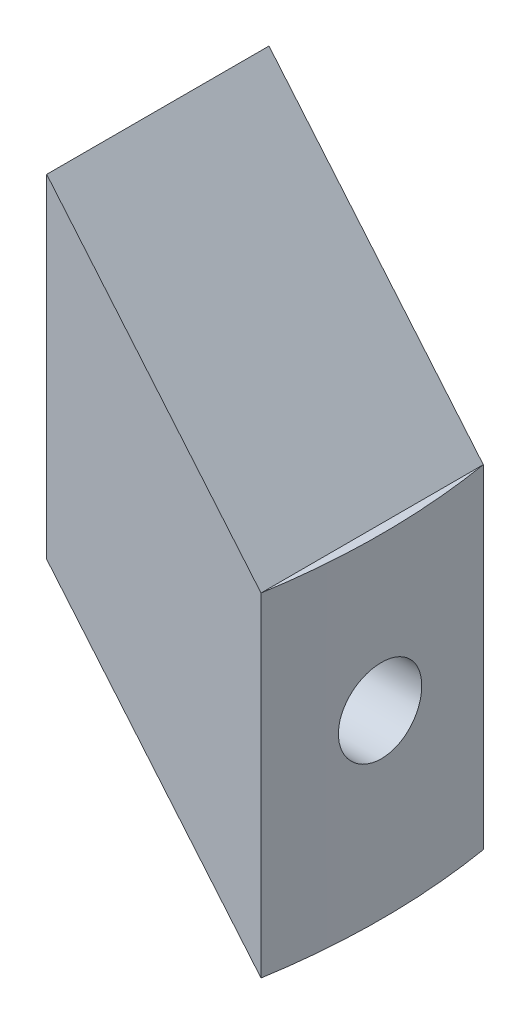
ISO-10303-21;
HEADER;
FILE_DESCRIPTION(('STEP AP214'),'2;1');
FILE_NAME('part.step','',(''),(''),'','','');
FILE_SCHEMA(('AUTOMOTIVE_DESIGN { 1 0 10303 214 1 1 1 1 }'));
ENDSEC;
DATA;
#1=APPLICATION_CONTEXT('core data for automotive mechanical design processes');
#2=APPLICATION_PROTOCOL_DEFINITION('international standard','automotive_design',2000,#1);
#3=PRODUCT_CONTEXT('',#1,'mechanical');
#4=PRODUCT('Part','Part','',(#3));
#5=PRODUCT_RELATED_PRODUCT_CATEGORY('part','',(#4));
#6=PRODUCT_DEFINITION_FORMATION('','',#4);
#7=PRODUCT_DEFINITION_CONTEXT('part definition',#1,'design');
#8=PRODUCT_DEFINITION('design','',#6,#7);
#9=PRODUCT_DEFINITION_SHAPE('','',#8);
#10=(LENGTH_UNIT() NAMED_UNIT(*) SI_UNIT(.MILLI.,.METRE.));
#11=(NAMED_UNIT(*) PLANE_ANGLE_UNIT() SI_UNIT($,.RADIAN.));
#12=(NAMED_UNIT(*) SI_UNIT($,.STERADIAN.) SOLID_ANGLE_UNIT());
#13=UNCERTAINTY_MEASURE_WITH_UNIT(LENGTH_MEASURE(1.E-05),#10,'distance_accuracy_value','');
#14=(GEOMETRIC_REPRESENTATION_CONTEXT(3) GLOBAL_UNCERTAINTY_ASSIGNED_CONTEXT((#13)) GLOBAL_UNIT_ASSIGNED_CONTEXT((#10,
#11,#12)) REPRESENTATION_CONTEXT('',''));
#15=CARTESIAN_POINT('',(0.,0.,0.));
#16=DIRECTION('',(0.,0.,1.));
#17=DIRECTION('',(1.,0.,0.));
#18=AXIS2_PLACEMENT_3D('',#15,#16,#17);
#19=CARTESIAN_POINT('',(-76.2,19.05,0.));
#20=DIRECTION('',(0.,-1.,0.));
#21=DIRECTION('',(0.,0.,-1.));
#22=AXIS2_PLACEMENT_3D('',#19,#20,#21);
#23=CYLINDRICAL_SURFACE('',#22,77.2510841347873);
#24=CARTESIAN_POINT('',(-76.2,-19.05,0.));
#25=DIRECTION('',(0.,1.,0.));
#26=DIRECTION('',(0.,0.,1.));
#27=AXIS2_PLACEMENT_3D('',#24,#25,#26);
#28=CIRCLE('',#27,77.2510841347873);
#29=CARTESIAN_POINT('',(0.,-19.05,12.7));
#30=VERTEX_POINT('',#29);
#31=CARTESIAN_POINT('',(0.,-19.05,-12.7));
#32=VERTEX_POINT('',#31);
#33=EDGE_CURVE('E105',#30,#32,#28,.T.);
#34=ORIENTED_EDGE('',*,*,#33,.T.);
#35=DIRECTION('',(0.,1.,0.));
#36=VECTOR('',#35,1.);
#37=CARTESIAN_POINT('',(0.,-19.05,-12.7));
#38=LINE('',#37,#36);
#39=CARTESIAN_POINT('',(0.,19.05,-12.7));
#40=VERTEX_POINT('',#39);
#41=EDGE_CURVE('E89',#32,#40,#38,.T.);
#42=ORIENTED_EDGE('',*,*,#41,.T.);
#43=CARTESIAN_POINT('',(-76.2,19.05,0.));
#44=DIRECTION('',(0.,1.,0.));
#45=DIRECTION('',(0.,0.,1.));
#46=AXIS2_PLACEMENT_3D('',#43,#44,#45);
#47=CIRCLE('',#46,77.2510841347873);
#48=CARTESIAN_POINT('',(0.,19.05,12.7));
#49=VERTEX_POINT('',#48);
#50=EDGE_CURVE('E93',#49,#40,#47,.T.);
#51=ORIENTED_EDGE('',*,*,#50,.F.);
#52=DIRECTION('',(0.,1.,0.));
#53=VECTOR('',#52,1.);
#54=CARTESIAN_POINT('',(0.,-19.05,12.7));
#55=LINE('',#54,#53);
#56=EDGE_CURVE('E54',#30,#49,#55,.T.);
#57=ORIENTED_EDGE('',*,*,#56,.F.);
#58=EDGE_LOOP('',(#34,#42,#51,#57));
#59=FACE_BOUND('',#58,.T.);
#60=CARTESIAN_POINT('',(1.05108413478734,-3.17499999999997,0.));
#61=CARTESIAN_POINT('',(1.05108431999969,-3.17500108915584,-0.133667498466971));
#62=CARTESIAN_POINT('',(1.05073648793064,-3.16937035603726,-0.267317619184964));
#63=CARTESIAN_POINT('',(1.04935527183057,-3.14688766263051,-0.533710608613792));
#64=CARTESIAN_POINT('',(1.04832171348621,-3.13003284914898,-0.66645323796754));
#65=CARTESIAN_POINT('',(1.04559675803787,-3.08519982438277,-0.930154213250308));
#66=CARTESIAN_POINT('',(1.04390479837631,-3.05721210035464,-1.06111093393915));
#67=CARTESIAN_POINT('',(1.03991038583466,-2.99030267972689,-1.32024291064169));
#68=CARTESIAN_POINT('',(1.03760770976408,-2.9513769854616,-1.44841713120738));
#69=CARTESIAN_POINT('',(1.03245975327947,-2.86291481323195,-1.70090945899853));
#70=CARTESIAN_POINT('',(1.02961496051403,-2.8133878664832,-1.82523091592366));
#71=CARTESIAN_POINT('',(1.02346079439124,-2.70403614233883,-2.06930241340175));
#72=CARTESIAN_POINT('',(1.02015125010524,-2.64420757432221,-2.18905075132629));
#73=CARTESIAN_POINT('',(1.01316412529302,-2.51473044071252,-2.42300976084194));
#74=CARTESIAN_POINT('',(1.00948676687778,-2.44508779125678,-2.5372237133415));
#75=CARTESIAN_POINT('',(1.00186483492667,-2.29642207701201,-2.75942584161713));
#76=CARTESIAN_POINT('',(0.997920163128742,-2.21739555467514,-2.86741170070358));
#77=CARTESIAN_POINT('',(0.989872608914028,-2.05046559036582,-3.07644588429448));
#78=CARTESIAN_POINT('',(0.985769584382032,-1.96255405428716,-3.1774877395851));
#79=CARTESIAN_POINT('',(0.977523403524849,-1.77850313666912,-3.37184641999783));
#80=CARTESIAN_POINT('',(0.973380232934779,-1.6823607277412,-3.4651603776883));
#81=CARTESIAN_POINT('',(0.965174054171688,-1.48258914213311,-3.64333177251122));
#82=CARTESIAN_POINT('',(0.961111020229295,-1.378962423837,-3.72819196487073));
#83=CARTESIAN_POINT('',(0.953177438511476,-1.1648877688195,-3.88891887038657));
#84=CARTESIAN_POINT('',(0.94930696234196,-1.05443732830597,-3.96478225222298));
#85=CARTESIAN_POINT('',(0.941868485099828,-0.827483271447736,-4.10696966728282));
#86=CARTESIAN_POINT('',(0.938300610805638,-0.710977150655919,-4.1732897102455));
#87=CARTESIAN_POINT('',(0.931569376689143,-0.472739513783651,-4.29590234354108));
#88=CARTESIAN_POINT('',(0.928406166884084,-0.351006082043343,-4.35219121814052));
#89=CARTESIAN_POINT('',(0.922577295365772,-0.103253346950619,-4.45428940734502));
#90=CARTESIAN_POINT('',(0.919911446107114,0.0227643196187598,-4.50010267358321));
#91=CARTESIAN_POINT('',(0.915150296238691,0.278232252171309,-4.58096165379357));
#92=CARTESIAN_POINT('',(0.91305520630086,0.407683766321214,-4.61600339251769));
#93=CARTESIAN_POINT('',(0.907729858497094,0.79938506160302,-4.70443264442233));
#94=CARTESIAN_POINT('',(0.905445160619983,1.06557347511543,-4.74136742898894));
#95=CARTESIAN_POINT('',(0.903677947076224,1.60023646297765,-4.77001262221915));
#96=CARTESIAN_POINT('',(0.904195400396212,1.86871101199237,-4.76172353140694));
#97=CARTESIAN_POINT('',(0.907966348231437,2.40011548742183,-4.70026192855033));
#98=CARTESIAN_POINT('',(0.911216102680486,2.66305248976145,-4.6471507700949));
#99=CARTESIAN_POINT('',(0.920080803850542,3.17626175010686,-4.49763214867585));
#100=CARTESIAN_POINT('',(0.925695764430544,3.42653393389315,-4.40122443201456));
#101=CARTESIAN_POINT('',(0.938662066434399,3.90751909322058,-4.16778385043787));
#102=CARTESIAN_POINT('',(0.94601459747409,4.13821852069212,-4.03072313625081));
#103=CARTESIAN_POINT('',(0.961626346754801,4.57335792209903,-3.71988627806004));
#104=CARTESIAN_POINT('',(0.969885574903982,4.77779760902149,-3.54610973281567));
#105=CARTESIAN_POINT('',(0.986396537957568,5.15497222187406,-3.16642869213783));
#106=CARTESIAN_POINT('',(0.994648237374023,5.32765368604503,-2.96047108159184));
#107=CARTESIAN_POINT('',(1.01020097995503,5.63599746750544,-2.52246045256922));
#108=CARTESIAN_POINT('',(1.01750202279575,5.77165977218446,-2.29040742520333));
#109=CARTESIAN_POINT('',(1.03033128237537,6.00210977168537,-1.80676078363053));
#110=CARTESIAN_POINT('',(1.03585941180686,6.09689545361074,-1.55516620785464));
#111=CARTESIAN_POINT('',(1.04451871417325,6.24286591460727,-1.03959275275447));
#112=CARTESIAN_POINT('',(1.04764991434651,6.29405118914817,-0.775614014198299));
#113=CARTESIAN_POINT('',(1.05115900706824,6.3513016597116,-0.243229501580076));
#114=CARTESIAN_POINT('',(1.05154141023572,6.35744077425597,0.0251682951683884));
#115=CARTESIAN_POINT('',(1.04952181327092,6.32461777156715,0.559179894096944));
#116=CARTESIAN_POINT('',(1.04711982723131,6.28565588260445,0.824793710360778));
#117=CARTESIAN_POINT('',(1.03980476910633,6.1637980795952,1.34548939178444));
#118=CARTESIAN_POINT('',(1.03489363479723,6.08093606710971,1.60057922039872));
#119=CARTESIAN_POINT('',(1.02311283165995,5.87366452603445,2.09323160649656));
#120=CARTESIAN_POINT('',(1.01624314568888,5.74925463378118,2.33079401054248));
#121=CARTESIAN_POINT('',(1.00130596900098,5.46223088063276,2.78198661239846));
#122=CARTESIAN_POINT('',(0.993236935029874,5.29956763809567,2.99558534434057));
#123=CARTESIAN_POINT('',(0.976814379293469,4.94072554333063,3.39247048356849));
#124=CARTESIAN_POINT('',(0.968460854801355,4.74454636978337,3.57575660021219));
#125=CARTESIAN_POINT('',(0.952397719166963,4.32392594076044,3.90706434288619));
#126=CARTESIAN_POINT('',(0.944688992605499,4.0994468859526,4.05503802387194));
#127=CARTESIAN_POINT('',(0.930799047999848,3.62877560859482,4.31119110969601));
#128=CARTESIAN_POINT('',(0.924617820742722,3.38258351701676,4.41937075454947));
#129=CARTESIAN_POINT('',(0.914485554356314,2.8756996317371,4.59278714444866));
#130=CARTESIAN_POINT('',(0.910532946940478,2.61501817651476,4.65805409267537));
#131=CARTESIAN_POINT('',(0.905302156356789,2.08622606742961,4.74387142872244));
#132=CARTESIAN_POINT('',(0.904023947500978,1.81811548494961,4.76442224604732));
#133=CARTESIAN_POINT('',(0.904213171258353,1.41670625780891,4.76132338773847));
#134=CARTESIAN_POINT('',(0.904626901065623,1.28306877314297,4.75464325335751));
#135=CARTESIAN_POINT('',(0.906138449227533,1.01684553609884,4.730073403309));
#136=CARTESIAN_POINT('',(0.907236014545448,0.884259413059387,4.71218783392697));
#137=CARTESIAN_POINT('',(0.91008568341901,0.621029051718817,4.66532187808255));
#138=CARTESIAN_POINT('',(0.911838028727337,0.490385549204182,4.63633739366852));
#139=CARTESIAN_POINT('',(0.915946204129012,0.232053670802607,4.56749716727203));
#140=CARTESIAN_POINT('',(0.918301812145738,0.104364226270523,4.52764542545927));
#141=CARTESIAN_POINT('',(0.923550940480387,-0.14724638186187,4.43733418610499));
#142=CARTESIAN_POINT('',(0.926444654191788,-0.271166171970107,4.38687087394308));
#143=CARTESIAN_POINT('',(0.932686082821485,-0.514268240810803,4.27572598061775));
#144=CARTESIAN_POINT('',(0.936033630551043,-0.633452243358476,4.21504816041515));
#145=CARTESIAN_POINT('',(0.943089878384008,-0.86632856121573,4.08387040957285));
#146=CARTESIAN_POINT('',(0.946798700659716,-0.980018999184705,4.01336715276734));
#147=CARTESIAN_POINT('',(0.954470084630168,-1.20102186591353,3.86308199984931));
#148=CARTESIAN_POINT('',(0.958432552800904,-1.30833661768717,3.78330351493188));
#149=CARTESIAN_POINT('',(0.966508189914249,-1.51607671130521,3.61484927975503));
#150=CARTESIAN_POINT('',(0.97062163382445,-1.61648841751633,3.5261567262981));
#151=CARTESIAN_POINT('',(0.978873853668533,-1.80944956445038,3.34066515580947));
#152=CARTESIAN_POINT('',(0.98301261973913,-1.90200188050552,3.24386912936842));
#153=CARTESIAN_POINT('',(0.991202297193028,-2.07868510398753,3.04276500875312));
#154=CARTESIAN_POINT('',(0.995253153071766,-2.16281080564106,2.93845233854267));
#155=CARTESIAN_POINT('',(1.00314809204323,-2.32194976801749,2.72314575356724));
#156=CARTESIAN_POINT('',(1.00699225085916,-2.39696637869374,2.61215431757631));
#157=CARTESIAN_POINT('',(1.01437236611433,-2.53750186457508,2.38405923426364));
#158=CARTESIAN_POINT('',(1.01790782352807,-2.60300547105579,2.26694616232965));
#159=CARTESIAN_POINT('',(1.02456195090812,-2.72388226205106,2.02764694710198));
#160=CARTESIAN_POINT('',(1.02768077303225,-2.7792591476481,1.9054626773265));
#161=CARTESIAN_POINT('',(1.03341201644761,-2.87947226212361,1.65695425458334));
#162=CARTESIAN_POINT('',(1.03602487354798,-2.92431756944568,1.53063377495658));
#163=CARTESIAN_POINT('',(1.04067281097135,-3.00319595791745,1.2746955252958));
#164=CARTESIAN_POINT('',(1.04270803934668,-3.03723180991117,1.14507860947054));
#165=CARTESIAN_POINT('',(1.04661060624973,-3.10201909753419,0.847827460309891));
#166=CARTESIAN_POINT('',(1.04828190959613,-3.12936257170015,0.679436867250043));
#167=CARTESIAN_POINT('',(1.0505185551168,-3.16585231678147,0.34068810841746));
#168=CARTESIAN_POINT('',(1.05108389877478,-3.17499861210942,0.170329945284644));
#169=CARTESIAN_POINT('',(1.05108413478734,-3.17499999999997,0.));
#170=B_SPLINE_CURVE_WITH_KNOTS('',3,(#60,#61,#62,#63,#64,#65,#66,#67,#68,#69,#70,#71,#72,#73,
#74,#75,#76,#77,#78,#79,#80,#81,#82,#83,#84,#85,#86,#87,#88,#89,#90,#91,#92,#93,#94,#95,#96,#97,
#98,#99,#100,#101,#102,#103,#104,#105,#106,#107,#108,#109,#110,#111,#112,#113,#114,#115,#116,
#117,#118,#119,#120,#121,#122,#123,#124,#125,#126,#127,#128,#129,#130,#131,#132,#133,#134,#135,
#136,#137,#138,#139,#140,#141,#142,#143,#144,#145,#146,#147,#148,#149,#150,#151,#152,#153,#154,
#155,#156,#157,#158,#159,#160,#161,#162,#163,#164,#165,#166,#167,#168,#169),.UNSPECIFIED.,.T.,
.F.,(4,2,2,2,2,2,2,2,2,2,2,2,2,2,2,2,2,2,2,2,2,2,2,2,2,2,2,2,2,2,2,2,2,2,2,2,2,2,2,2,2,2,2,2,2,
2,2,2,2,2,2,2,2,2,4),(0.,0.400853653072875,0.80180924320925,1.20310817655789,1.60455396990298,
2.00564034207832,2.40687461604366,2.80786804396212,3.20900968162218,3.61052010442315,
4.01217884608529,4.41370624903169,4.81538186752889,5.21722494964585,5.61921657399759,
6.02105630705456,6.42304416209971,7.22512394108956,8.02719484292084,8.82816962706972,
9.62914910461921,10.4306785642177,11.2322167836028,12.0350922018924,12.8379678936776,
13.6408831171336,14.4437892162367,15.2453774908555,16.0469617083993,16.847927808542,
17.648900919627,18.4509137466068,19.2529342629655,20.0560375954619,20.8591360840135,
21.661668722118,22.4641936517531,22.8652185487773,23.2660951443329,23.6671198948521,
24.0679972294555,24.4690189175323,24.8698932719179,25.2709036638431,25.6717670380256,
26.0734007485134,26.4748868838354,26.8766195380693,27.2782040010139,27.6804260624379,
28.0825008259084,28.4842277096383,28.8858515333514,29.3966523875338,29.9074525564464),.UNSPECIFIED.);
#171=CARTESIAN_POINT('',(1.05108413478734,-3.17499999999997,0.));
#172=VERTEX_POINT('',#171);
#173=EDGE_CURVE('E11',#172,#172,#170,.T.);
#174=ORIENTED_EDGE('',*,*,#173,.F.);
#175=EDGE_LOOP('',(#174));
#176=FACE_BOUND('',#175,.T.);
#177=ADVANCED_FACE('F33',(#59,#176),#23,.T.);
#178=CARTESIAN_POINT('',(0.,19.05,12.7));
#179=DIRECTION('',(-0.766044443118978,-0.64278760968654,0.));
#180=DIRECTION('',(0.64278760968654,-0.766044443118978,0.));
#181=AXIS2_PLACEMENT_3D('',#178,#179,#180);
#182=PLANE('',#181);
#183=DIRECTION('',(-0.64278760968654,0.766044443118978,0.));
#184=VECTOR('',#183,1.);
#185=CARTESIAN_POINT('',(0.,19.05,-12.7));
#186=LINE('',#185,#184);
#187=CARTESIAN_POINT('',(-24.4902079290572,48.236293282833,-12.7));
#188=VERTEX_POINT('',#187);
#189=EDGE_CURVE('E85',#40,#188,#186,.T.);
#190=ORIENTED_EDGE('',*,*,#189,.T.);
#191=DIRECTION('',(0.,0.,-1.));
#192=VECTOR('',#191,1.);
#193=CARTESIAN_POINT('',(-24.4902079290572,48.236293282833,12.7));
#194=LINE('',#193,#192);
#195=CARTESIAN_POINT('',(-24.4902079290572,48.236293282833,12.7));
#196=VERTEX_POINT('',#195);
#197=EDGE_CURVE('E46',#196,#188,#194,.T.);
#198=ORIENTED_EDGE('',*,*,#197,.F.);
#199=DIRECTION('',(-0.64278760968654,0.766044443118978,0.));
#200=VECTOR('',#199,1.);
#201=CARTESIAN_POINT('',(0.,19.05,12.7));
#202=LINE('',#201,#200);
#203=EDGE_CURVE('E98',#49,#196,#202,.T.);
#204=ORIENTED_EDGE('',*,*,#203,.F.);
#205=DIRECTION('',(0.,0.,-1.));
#206=VECTOR('',#205,1.);
#207=CARTESIAN_POINT('',(0.,19.05,12.7));
#208=LINE('',#207,#206);
#209=EDGE_CURVE('E96',#49,#40,#208,.T.);
#210=ORIENTED_EDGE('',*,*,#209,.T.);
#211=EDGE_LOOP('',(#190,#198,#204,#210));
#212=FACE_BOUND('',#211,.T.);
#213=ADVANCED_FACE('F35',(#212),#182,.F.);
#214=CARTESIAN_POINT('',(-24.4902079290572,48.236293282833,12.7));
#215=DIRECTION('',(1.,0.,0.));
#216=DIRECTION('',(0.,0.,-1.));
#217=AXIS2_PLACEMENT_3D('',#214,#215,#216);
#218=PLANE('',#217);
#219=DIRECTION('',(0.,-1.,0.));
#220=VECTOR('',#219,1.);
#221=CARTESIAN_POINT('',(-24.4902079290572,48.236293282833,-12.7));
#222=LINE('',#221,#220);
#223=CARTESIAN_POINT('',(-24.4902079290572,10.136293282833,-12.7));
#224=VERTEX_POINT('',#223);
#225=EDGE_CURVE('E68',#188,#224,#222,.T.);
#226=ORIENTED_EDGE('',*,*,#225,.T.);
#227=DIRECTION('',(0.,0.,-1.));
#228=VECTOR('',#227,1.);
#229=CARTESIAN_POINT('',(-24.4902079290572,10.136293282833,12.7));
#230=LINE('',#229,#228);
#231=CARTESIAN_POINT('',(-24.4902079290572,10.136293282833,12.7));
#232=VERTEX_POINT('',#231);
#233=EDGE_CURVE('E116',#232,#224,#230,.T.);
#234=ORIENTED_EDGE('',*,*,#233,.F.);
#235=DIRECTION('',(0.,-1.,0.));
#236=VECTOR('',#235,1.);
#237=CARTESIAN_POINT('',(-24.4902079290572,48.236293282833,12.7));
#238=LINE('',#237,#236);
#239=EDGE_CURVE('E80',#196,#232,#238,.T.);
#240=ORIENTED_EDGE('',*,*,#239,.F.);
#241=ORIENTED_EDGE('',*,*,#197,.T.);
#242=EDGE_LOOP('',(#226,#234,#240,#241));
#243=FACE_BOUND('',#242,.T.);
#244=ADVANCED_FACE('F117',(#243),#218,.F.);
#245=CARTESIAN_POINT('',(0.,-19.05,12.7));
#246=DIRECTION('',(0.766044443118976,0.642787609686542,0.));
#247=DIRECTION('',(-0.642787609686542,0.766044443118976,0.));
#248=AXIS2_PLACEMENT_3D('',#245,#246,#247);
#249=PLANE('',#248);
#250=DIRECTION('',(0.642787609686542,-0.766044443118976,0.));
#251=VECTOR('',#250,1.);
#252=CARTESIAN_POINT('',(0.,-19.05,-12.7));
#253=LINE('',#252,#251);
#254=EDGE_CURVE('E75',#224,#32,#253,.T.);
#255=ORIENTED_EDGE('',*,*,#254,.T.);
#256=DIRECTION('',(0.,0.,-1.));
#257=VECTOR('',#256,1.);
#258=CARTESIAN_POINT('',(0.,-19.05,12.7));
#259=LINE('',#258,#257);
#260=EDGE_CURVE('E101',#30,#32,#259,.T.);
#261=ORIENTED_EDGE('',*,*,#260,.F.);
#262=DIRECTION('',(0.642787609686542,-0.766044443118976,0.));
#263=VECTOR('',#262,1.);
#264=CARTESIAN_POINT('',(0.,-19.05,12.7));
#265=LINE('',#264,#263);
#266=EDGE_CURVE('E163',#232,#30,#265,.T.);
#267=ORIENTED_EDGE('',*,*,#266,.F.);
#268=ORIENTED_EDGE('',*,*,#233,.T.);
#269=EDGE_LOOP('',(#255,#261,#267,#268));
#270=FACE_BOUND('',#269,.T.);
#271=ADVANCED_FACE('F119',(#270),#249,.F.);
#272=CARTESIAN_POINT('',(0.,0.,12.7));
#273=DIRECTION('',(0.,0.,1.));
#274=DIRECTION('',(1.,0.,0.));
#275=AXIS2_PLACEMENT_3D('',#272,#273,#274);
#276=PLANE('',#275);
#277=ORIENTED_EDGE('',*,*,#203,.T.);
#278=ORIENTED_EDGE('',*,*,#239,.T.);
#279=ORIENTED_EDGE('',*,*,#266,.T.);
#280=ORIENTED_EDGE('',*,*,#56,.T.);
#281=EDGE_LOOP('',(#277,#278,#279,#280));
#282=FACE_BOUND('',#281,.T.);
#283=ADVANCED_FACE('F124',(#282),#276,.T.);
#284=CARTESIAN_POINT('',(0.,0.,-12.7));
#285=DIRECTION('',(0.,0.,1.));
#286=DIRECTION('',(1.,0.,0.));
#287=AXIS2_PLACEMENT_3D('',#284,#285,#286);
#288=PLANE('',#287);
#289=ORIENTED_EDGE('',*,*,#189,.F.);
#290=ORIENTED_EDGE('',*,*,#41,.F.);
#291=ORIENTED_EDGE('',*,*,#254,.F.);
#292=ORIENTED_EDGE('',*,*,#225,.F.);
#293=EDGE_LOOP('',(#289,#290,#291,#292));
#294=FACE_BOUND('',#293,.T.);
#295=ADVANCED_FACE('F87',(#294),#288,.F.);
#296=CARTESIAN_POINT('',(-76.2,19.05,0.));
#297=DIRECTION('',(0.,1.,0.));
#298=DIRECTION('',(0.,0.,1.));
#299=AXIS2_PLACEMENT_3D('',#296,#297,#298);
#300=PLANE('',#299);
#301=ORIENTED_EDGE('',*,*,#50,.T.);
#302=ORIENTED_EDGE('',*,*,#209,.F.);
#303=EDGE_LOOP('',(#301,#302));
#304=FACE_BOUND('',#303,.T.);
#305=ADVANCED_FACE('F103',(#304),#300,.T.);
#306=CARTESIAN_POINT('',(-76.2,-19.05,0.));
#307=DIRECTION('',(0.,1.,0.));
#308=DIRECTION('',(0.,0.,1.));
#309=AXIS2_PLACEMENT_3D('',#306,#307,#308);
#310=PLANE('',#309);
#311=ORIENTED_EDGE('',*,*,#33,.F.);
#312=ORIENTED_EDGE('',*,*,#260,.T.);
#313=EDGE_LOOP('',(#311,#312));
#314=FACE_BOUND('',#313,.T.);
#315=ADVANCED_FACE('F132',(#314),#310,.F.);
#316=CARTESIAN_POINT('',(-31.4555929340305,1.58750000000001,0.));
#317=DIRECTION('',(-1.,0.,0.));
#318=DIRECTION('',(0.,-1.,0.));
#319=AXIS2_PLACEMENT_3D('',#316,#317,#318);
#320=CYLINDRICAL_SURFACE('',#319,4.76249999999999);
#321=CARTESIAN_POINT('',(-11.6489158652125,1.58750000000001,0.));
#322=DIRECTION('',(-1.,0.,0.));
#323=DIRECTION('',(0.,-1.,0.));
#324=AXIS2_PLACEMENT_3D('',#321,#322,#323);
#325=CIRCLE('',#324,4.7625);
#326=CARTESIAN_POINT('',(-11.6489158652125,-3.17499999999998,0.));
#327=VERTEX_POINT('',#326);
#328=EDGE_CURVE('E157',#327,#327,#325,.T.);
#329=ORIENTED_EDGE('',*,*,#328,.T.);
#330=EDGE_LOOP('',(#329));
#331=FACE_BOUND('',#330,.T.);
#332=ORIENTED_EDGE('',*,*,#173,.T.);
#333=EDGE_LOOP('',(#332));
#334=FACE_BOUND('',#333,.T.);
#335=ADVANCED_FACE('F143',(#331,#334),#320,.F.);
#336=CARTESIAN_POINT('',(-11.6489158652125,1.58750000000002,0.));
#337=DIRECTION('',(1.,0.,0.));
#338=DIRECTION('',(0.,1.,0.));
#339=AXIS2_PLACEMENT_3D('',#336,#337,#338);
#340=PLANE('',#339);
#341=ORIENTED_EDGE('',*,*,#328,.F.);
#342=EDGE_LOOP('',(#341));
#343=FACE_BOUND('',#342,.T.);
#344=ADVANCED_FACE('F146',(#343),#340,.T.);
#345=CLOSED_SHELL('',(#177,#213,#244,#271,#283,#295,#305,#315,#335,#344));
#346=MANIFOLD_SOLID_BREP('B2',#345);
#347=ADVANCED_BREP_SHAPE_REPRESENTATION('',(#18,#346),#14);
#348=SHAPE_DEFINITION_REPRESENTATION(#9,#347);
ENDSEC;
END-ISO-10303-21;
